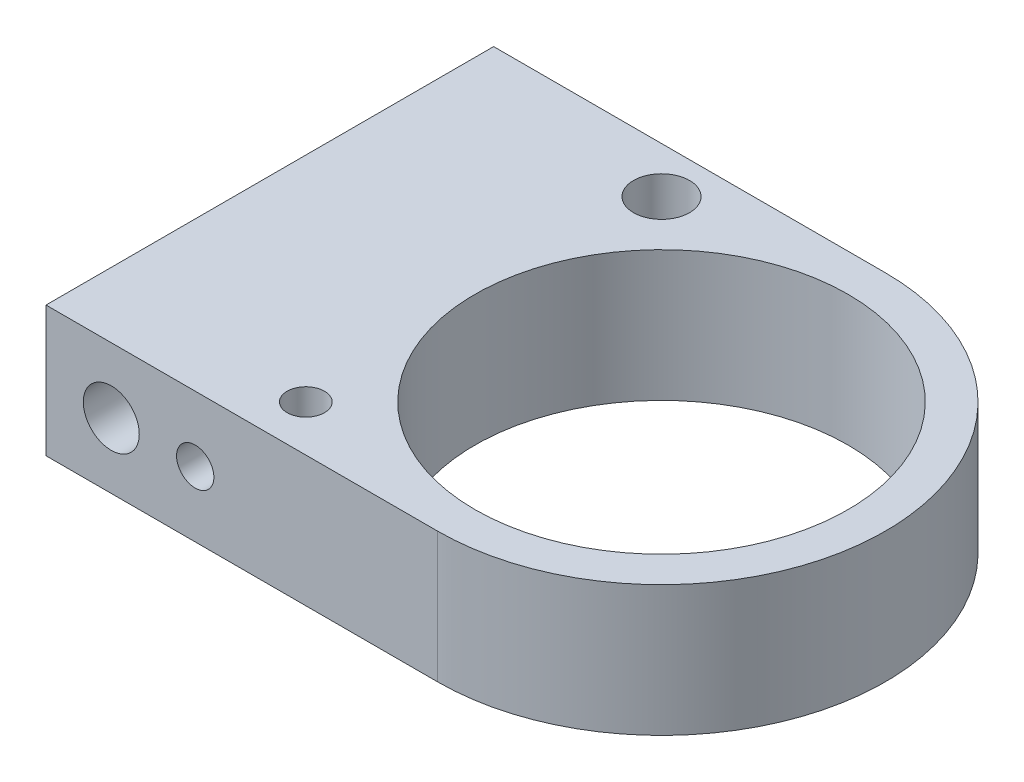
ISO-10303-21;
HEADER;
FILE_DESCRIPTION(('STEP AP214'),'2;1');
FILE_NAME('part.step','',(''),(''),'','','');
FILE_SCHEMA(('AUTOMOTIVE_DESIGN { 1 0 10303 214 1 1 1 1 }'));
ENDSEC;
DATA;
#1=APPLICATION_CONTEXT('core data for automotive mechanical design processes');
#2=APPLICATION_PROTOCOL_DEFINITION('international standard','automotive_design',2000,#1);
#3=PRODUCT_CONTEXT('',#1,'mechanical');
#4=PRODUCT('Part','Part','',(#3));
#5=PRODUCT_RELATED_PRODUCT_CATEGORY('part','',(#4));
#6=PRODUCT_DEFINITION_FORMATION('','',#4);
#7=PRODUCT_DEFINITION_CONTEXT('part definition',#1,'design');
#8=PRODUCT_DEFINITION('design','',#6,#7);
#9=PRODUCT_DEFINITION_SHAPE('','',#8);
#10=(LENGTH_UNIT() NAMED_UNIT(*) SI_UNIT(.MILLI.,.METRE.));
#11=(NAMED_UNIT(*) PLANE_ANGLE_UNIT() SI_UNIT($,.RADIAN.));
#12=(NAMED_UNIT(*) SI_UNIT($,.STERADIAN.) SOLID_ANGLE_UNIT());
#13=UNCERTAINTY_MEASURE_WITH_UNIT(LENGTH_MEASURE(1.E-05),#10,'distance_accuracy_value','');
#14=(GEOMETRIC_REPRESENTATION_CONTEXT(3) GLOBAL_UNCERTAINTY_ASSIGNED_CONTEXT((#13)) GLOBAL_UNIT_ASSIGNED_CONTEXT((#10,
#11,#12)) REPRESENTATION_CONTEXT('',''));
#15=CARTESIAN_POINT('',(0.,0.,0.));
#16=DIRECTION('',(0.,0.,1.));
#17=DIRECTION('',(1.,0.,0.));
#18=AXIS2_PLACEMENT_3D('',#15,#16,#17);
#19=CARTESIAN_POINT('',(0.,3.5,6.));
#20=DIRECTION('',(0.,0.,-1.));
#21=DIRECTION('',(-1.,0.,0.));
#22=AXIS2_PLACEMENT_3D('',#19,#20,#21);
#23=PLANE('',#22);
#24=CARTESIAN_POINT('',(-8.75,1.75,6.));
#25=DIRECTION('',(0.,0.,-1.));
#26=DIRECTION('',(-1.,0.,0.));
#27=AXIS2_PLACEMENT_3D('',#24,#25,#26);
#28=CIRCLE('',#27,0.75);
#29=CARTESIAN_POINT('',(-8.,1.75,6.));
#30=VERTEX_POINT('',#29);
#31=EDGE_CURVE('E118',#30,#30,#28,.T.);
#32=ORIENTED_EDGE('',*,*,#31,.T.);
#33=EDGE_LOOP('',(#32));
#34=FACE_BOUND('',#33,.T.);
#35=CARTESIAN_POINT('',(-6.5,1.75,6.));
#36=DIRECTION('',(0.,0.,-1.));
#37=DIRECTION('',(-1.,0.,0.));
#38=AXIS2_PLACEMENT_3D('',#35,#36,#37);
#39=CIRCLE('',#38,0.5);
#40=CARTESIAN_POINT('',(-7.,1.75,6.));
#41=VERTEX_POINT('',#40);
#42=EDGE_CURVE('E143',#41,#41,#39,.T.);
#43=ORIENTED_EDGE('',*,*,#42,.T.);
#44=EDGE_LOOP('',(#43));
#45=FACE_BOUND('',#44,.T.);
#46=DIRECTION('',(1.,0.,0.));
#47=VECTOR('',#46,1.);
#48=CARTESIAN_POINT('',(0.,0.,6.));
#49=LINE('',#48,#47);
#50=CARTESIAN_POINT('',(-10.5,0.,6.));
#51=VERTEX_POINT('',#50);
#52=CARTESIAN_POINT('',(0.,0.,6.));
#53=VERTEX_POINT('',#52);
#54=EDGE_CURVE('E114',#51,#53,#49,.T.);
#55=ORIENTED_EDGE('',*,*,#54,.T.);
#56=DIRECTION('',(0.,-1.,0.));
#57=VECTOR('',#56,1.);
#58=CARTESIAN_POINT('',(0.,3.5,6.));
#59=LINE('',#58,#57);
#60=CARTESIAN_POINT('',(0.,3.5,6.));
#61=VERTEX_POINT('',#60);
#62=EDGE_CURVE('E11',#61,#53,#59,.T.);
#63=ORIENTED_EDGE('',*,*,#62,.F.);
#64=DIRECTION('',(1.,0.,0.));
#65=VECTOR('',#64,1.);
#66=CARTESIAN_POINT('',(0.,3.5,6.));
#67=LINE('',#66,#65);
#68=CARTESIAN_POINT('',(-10.5,3.5,6.));
#69=VERTEX_POINT('',#68);
#70=EDGE_CURVE('E94',#69,#61,#67,.T.);
#71=ORIENTED_EDGE('',*,*,#70,.F.);
#72=DIRECTION('',(0.,-1.,0.));
#73=VECTOR('',#72,1.);
#74=CARTESIAN_POINT('',(-10.5,3.5,6.));
#75=LINE('',#74,#73);
#76=EDGE_CURVE('E113',#69,#51,#75,.T.);
#77=ORIENTED_EDGE('',*,*,#76,.T.);
#78=EDGE_LOOP('',(#55,#63,#71,#77));
#79=FACE_BOUND('',#78,.T.);
#80=ADVANCED_FACE('F41',(#34,#45,#79),#23,.F.);
#81=CARTESIAN_POINT('',(0.,3.5,0.));
#82=DIRECTION('',(0.,-1.,0.));
#83=DIRECTION('',(0.,0.,-1.));
#84=AXIS2_PLACEMENT_3D('',#81,#82,#83);
#85=CYLINDRICAL_SURFACE('',#84,6.);
#86=CARTESIAN_POINT('',(0.,0.,0.));
#87=DIRECTION('',(0.,1.,0.));
#88=DIRECTION('',(0.,0.,1.));
#89=AXIS2_PLACEMENT_3D('',#86,#87,#88);
#90=CIRCLE('',#89,6.);
#91=CARTESIAN_POINT('',(0.,0.,-6.));
#92=VERTEX_POINT('',#91);
#93=EDGE_CURVE('E99',#53,#92,#90,.T.);
#94=ORIENTED_EDGE('',*,*,#93,.T.);
#95=DIRECTION('',(0.,-1.,0.));
#96=VECTOR('',#95,1.);
#97=CARTESIAN_POINT('',(0.,3.5,-6.));
#98=LINE('',#97,#96);
#99=CARTESIAN_POINT('',(0.,3.5,-6.));
#100=VERTEX_POINT('',#99);
#101=EDGE_CURVE('E50',#100,#92,#98,.T.);
#102=ORIENTED_EDGE('',*,*,#101,.F.);
#103=CARTESIAN_POINT('',(0.,3.5,0.));
#104=DIRECTION('',(0.,1.,0.));
#105=DIRECTION('',(0.,0.,1.));
#106=AXIS2_PLACEMENT_3D('',#103,#104,#105);
#107=CIRCLE('',#106,6.);
#108=EDGE_CURVE('E88',#61,#100,#107,.T.);
#109=ORIENTED_EDGE('',*,*,#108,.F.);
#110=ORIENTED_EDGE('',*,*,#62,.T.);
#111=EDGE_LOOP('',(#94,#102,#109,#110));
#112=FACE_BOUND('',#111,.T.);
#113=ADVANCED_FACE('F98',(#112),#85,.T.);
#114=CARTESIAN_POINT('',(0.,3.5,-5.99999999999998));
#115=DIRECTION('',(0.,0.,1.));
#116=DIRECTION('',(1.,0.,0.));
#117=AXIS2_PLACEMENT_3D('',#114,#115,#116);
#118=PLANE('',#117);
#119=CARTESIAN_POINT('',(-8.75,1.75,-6.));
#120=DIRECTION('',(0.,0.,1.));
#121=DIRECTION('',(1.,0.,0.));
#122=AXIS2_PLACEMENT_3D('',#119,#120,#121);
#123=CIRCLE('',#122,0.75);
#124=CARTESIAN_POINT('',(-8.,1.75,-6.));
#125=VERTEX_POINT('',#124);
#126=EDGE_CURVE('E147',#125,#125,#123,.T.);
#127=ORIENTED_EDGE('',*,*,#126,.T.);
#128=EDGE_LOOP('',(#127));
#129=FACE_BOUND('',#128,.T.);
#130=CARTESIAN_POINT('',(-6.5,1.75,-6.));
#131=DIRECTION('',(0.,0.,1.));
#132=DIRECTION('',(1.,0.,0.));
#133=AXIS2_PLACEMENT_3D('',#130,#131,#132);
#134=CIRCLE('',#133,0.5);
#135=CARTESIAN_POINT('',(-6.,1.75,-6.));
#136=VERTEX_POINT('',#135);
#137=EDGE_CURVE('E148',#136,#136,#134,.T.);
#138=ORIENTED_EDGE('',*,*,#137,.T.);
#139=EDGE_LOOP('',(#138));
#140=FACE_BOUND('',#139,.T.);
#141=DIRECTION('',(-1.,0.,0.));
#142=VECTOR('',#141,1.);
#143=CARTESIAN_POINT('',(0.,0.,-5.99999999999998));
#144=LINE('',#143,#142);
#145=CARTESIAN_POINT('',(-10.5,0.,-6.));
#146=VERTEX_POINT('',#145);
#147=EDGE_CURVE('E75',#92,#146,#144,.T.);
#148=ORIENTED_EDGE('',*,*,#147,.T.);
#149=DIRECTION('',(0.,-1.,0.));
#150=VECTOR('',#149,1.);
#151=CARTESIAN_POINT('',(-10.5,3.5,-6.));
#152=LINE('',#151,#150);
#153=CARTESIAN_POINT('',(-10.5,3.5,-6.));
#154=VERTEX_POINT('',#153);
#155=EDGE_CURVE('E101',#154,#146,#152,.T.);
#156=ORIENTED_EDGE('',*,*,#155,.F.);
#157=DIRECTION('',(-1.,0.,0.));
#158=VECTOR('',#157,1.);
#159=CARTESIAN_POINT('',(0.,3.5,-5.99999999999998));
#160=LINE('',#159,#158);
#161=EDGE_CURVE('E92',#100,#154,#160,.T.);
#162=ORIENTED_EDGE('',*,*,#161,.F.);
#163=ORIENTED_EDGE('',*,*,#101,.T.);
#164=EDGE_LOOP('',(#148,#156,#162,#163));
#165=FACE_BOUND('',#164,.T.);
#166=ADVANCED_FACE('F102',(#129,#140,#165),#118,.F.);
#167=CARTESIAN_POINT('',(-10.5,3.5,0.));
#168=DIRECTION('',(1.,0.,0.));
#169=DIRECTION('',(0.,0.,-1.));
#170=AXIS2_PLACEMENT_3D('',#167,#168,#169);
#171=PLANE('',#170);
#172=DIRECTION('',(0.,0.,1.));
#173=VECTOR('',#172,1.);
#174=CARTESIAN_POINT('',(-10.5,0.,0.));
#175=LINE('',#174,#173);
#176=EDGE_CURVE('E81',#146,#51,#175,.T.);
#177=ORIENTED_EDGE('',*,*,#176,.T.);
#178=ORIENTED_EDGE('',*,*,#76,.F.);
#179=DIRECTION('',(0.,0.,1.));
#180=VECTOR('',#179,1.);
#181=CARTESIAN_POINT('',(-10.5,3.5,0.));
#182=LINE('',#181,#180);
#183=EDGE_CURVE('E58',#154,#69,#182,.T.);
#184=ORIENTED_EDGE('',*,*,#183,.F.);
#185=ORIENTED_EDGE('',*,*,#155,.T.);
#186=EDGE_LOOP('',(#177,#178,#184,#185));
#187=FACE_BOUND('',#186,.T.);
#188=ADVANCED_FACE('F132',(#187),#171,.F.);
#189=CARTESIAN_POINT('',(0.,3.5,0.));
#190=DIRECTION('',(0.,-1.,0.));
#191=DIRECTION('',(0.,0.,-1.));
#192=AXIS2_PLACEMENT_3D('',#189,#190,#191);
#193=CYLINDRICAL_SURFACE('',#192,5.);
#194=CARTESIAN_POINT('',(0.,3.5,0.));
#195=DIRECTION('',(0.,1.,0.));
#196=DIRECTION('',(0.,0.,1.));
#197=AXIS2_PLACEMENT_3D('',#194,#195,#196);
#198=CIRCLE('',#197,5.);
#199=CARTESIAN_POINT('',(0.,3.5,5.));
#200=VERTEX_POINT('',#199);
#201=EDGE_CURVE('E106',#200,#200,#198,.T.);
#202=ORIENTED_EDGE('',*,*,#201,.T.);
#203=EDGE_LOOP('',(#202));
#204=FACE_BOUND('',#203,.T.);
#205=CARTESIAN_POINT('',(0.,0.,0.));
#206=DIRECTION('',(0.,1.,0.));
#207=DIRECTION('',(0.,0.,1.));
#208=AXIS2_PLACEMENT_3D('',#205,#206,#207);
#209=CIRCLE('',#208,5.);
#210=CARTESIAN_POINT('',(0.,0.,5.));
#211=VERTEX_POINT('',#210);
#212=EDGE_CURVE('E125',#211,#211,#209,.T.);
#213=ORIENTED_EDGE('',*,*,#212,.F.);
#214=EDGE_LOOP('',(#213));
#215=FACE_BOUND('',#214,.T.);
#216=ADVANCED_FACE('F183',(#204,#215),#193,.F.);
#217=CARTESIAN_POINT('',(0.,3.5,0.));
#218=DIRECTION('',(0.,1.,0.));
#219=DIRECTION('',(0.,0.,1.));
#220=AXIS2_PLACEMENT_3D('',#217,#218,#219);
#221=PLANE('',#220);
#222=CARTESIAN_POINT('',(-4.76776695296637,3.5,-4.76776695296637));
#223=DIRECTION('',(0.,1.,0.));
#224=DIRECTION('',(0.,0.,1.));
#225=AXIS2_PLACEMENT_3D('',#222,#223,#224);
#226=CIRCLE('',#225,0.75);
#227=CARTESIAN_POINT('',(-4.76776695296637,3.5,-4.01776695296637));
#228=VERTEX_POINT('',#227);
#229=EDGE_CURVE('E164',#228,#228,#226,.T.);
#230=ORIENTED_EDGE('',*,*,#229,.F.);
#231=EDGE_LOOP('',(#230));
#232=FACE_BOUND('',#231,.T.);
#233=CARTESIAN_POINT('',(-4.76776695296637,3.5,4.76776695296637));
#234=DIRECTION('',(0.,1.,0.));
#235=DIRECTION('',(0.,0.,-1.));
#236=AXIS2_PLACEMENT_3D('',#233,#234,#235);
#237=CIRCLE('',#236,0.500000000000001);
#238=CARTESIAN_POINT('',(-4.76776695296637,3.5,4.26776695296637));
#239=VERTEX_POINT('',#238);
#240=EDGE_CURVE('E156',#239,#239,#237,.T.);
#241=ORIENTED_EDGE('',*,*,#240,.F.);
#242=EDGE_LOOP('',(#241));
#243=FACE_BOUND('',#242,.T.);
#244=ORIENTED_EDGE('',*,*,#70,.T.);
#245=ORIENTED_EDGE('',*,*,#108,.T.);
#246=ORIENTED_EDGE('',*,*,#161,.T.);
#247=ORIENTED_EDGE('',*,*,#183,.T.);
#248=EDGE_LOOP('',(#244,#245,#246,#247));
#249=FACE_BOUND('',#248,.T.);
#250=ORIENTED_EDGE('',*,*,#201,.F.);
#251=EDGE_LOOP('',(#250));
#252=FACE_BOUND('',#251,.T.);
#253=ADVANCED_FACE('F89',(#232,#243,#249,#252),#221,.T.);
#254=CARTESIAN_POINT('',(0.,0.,0.));
#255=DIRECTION('',(0.,1.,0.));
#256=DIRECTION('',(0.,0.,1.));
#257=AXIS2_PLACEMENT_3D('',#254,#255,#256);
#258=PLANE('',#257);
#259=CARTESIAN_POINT('',(-4.76776695296637,0.,-4.76776695296637));
#260=DIRECTION('',(0.,1.,0.));
#261=DIRECTION('',(0.,0.,1.));
#262=AXIS2_PLACEMENT_3D('',#259,#260,#261);
#263=CIRCLE('',#262,0.75);
#264=CARTESIAN_POINT('',(-4.76776695296637,0.,-4.01776695296637));
#265=VERTEX_POINT('',#264);
#266=EDGE_CURVE('E152',#265,#265,#263,.T.);
#267=ORIENTED_EDGE('',*,*,#266,.T.);
#268=EDGE_LOOP('',(#267));
#269=FACE_BOUND('',#268,.T.);
#270=CARTESIAN_POINT('',(-4.76776695296637,0.,4.76776695296637));
#271=DIRECTION('',(0.,1.,0.));
#272=DIRECTION('',(0.,0.,-1.));
#273=AXIS2_PLACEMENT_3D('',#270,#271,#272);
#274=CIRCLE('',#273,0.500000000000001);
#275=CARTESIAN_POINT('',(-4.76776695296637,0.,4.26776695296637));
#276=VERTEX_POINT('',#275);
#277=EDGE_CURVE('E160',#276,#276,#274,.T.);
#278=ORIENTED_EDGE('',*,*,#277,.T.);
#279=EDGE_LOOP('',(#278));
#280=FACE_BOUND('',#279,.T.);
#281=ORIENTED_EDGE('',*,*,#54,.F.);
#282=ORIENTED_EDGE('',*,*,#176,.F.);
#283=ORIENTED_EDGE('',*,*,#147,.F.);
#284=ORIENTED_EDGE('',*,*,#93,.F.);
#285=EDGE_LOOP('',(#281,#282,#283,#284));
#286=FACE_BOUND('',#285,.T.);
#287=ORIENTED_EDGE('',*,*,#212,.T.);
#288=EDGE_LOOP('',(#287));
#289=FACE_BOUND('',#288,.T.);
#290=ADVANCED_FACE('F135',(#269,#280,#286,#289),#258,.F.);
#291=CARTESIAN_POINT('',(-6.5,1.75,-6.));
#292=DIRECTION('',(0.,0.,1.));
#293=DIRECTION('',(1.,0.,0.));
#294=AXIS2_PLACEMENT_3D('',#291,#292,#293);
#295=CYLINDRICAL_SURFACE('',#294,0.5);
#296=ORIENTED_EDGE('',*,*,#137,.F.);
#297=EDGE_LOOP('',(#296));
#298=FACE_BOUND('',#297,.T.);
#299=ORIENTED_EDGE('',*,*,#42,.F.);
#300=EDGE_LOOP('',(#299));
#301=FACE_BOUND('',#300,.T.);
#302=ADVANCED_FACE('F194',(#298,#301),#295,.F.);
#303=CARTESIAN_POINT('',(-8.75,1.75,-6.));
#304=DIRECTION('',(0.,0.,1.));
#305=DIRECTION('',(1.,0.,0.));
#306=AXIS2_PLACEMENT_3D('',#303,#304,#305);
#307=CYLINDRICAL_SURFACE('',#306,0.75);
#308=CARTESIAN_POINT('',(-8.,1.75,-6.));
#309=CARTESIAN_POINT('',(-8.,1.75,-5.875));
#310=CARTESIAN_POINT('',(-8.,1.75,-5.75));
#311=CARTESIAN_POINT('',(-8.,1.75,-5.5));
#312=CARTESIAN_POINT('',(-8.,1.75,-5.375));
#313=CARTESIAN_POINT('',(-8.,1.75,-5.125));
#314=CARTESIAN_POINT('',(-8.,1.75,-5.));
#315=CARTESIAN_POINT('',(-8.,1.75,-4.75));
#316=CARTESIAN_POINT('',(-8.,1.75,-4.625));
#317=CARTESIAN_POINT('',(-8.,1.75,-4.375));
#318=CARTESIAN_POINT('',(-8.,1.75,-4.25));
#319=CARTESIAN_POINT('',(-8.,1.75,-4.));
#320=CARTESIAN_POINT('',(-8.,1.75,-3.875));
#321=CARTESIAN_POINT('',(-8.,1.75,-3.625));
#322=CARTESIAN_POINT('',(-8.,1.75,-3.5));
#323=CARTESIAN_POINT('',(-8.,1.75,-3.25));
#324=CARTESIAN_POINT('',(-8.,1.75,-3.125));
#325=CARTESIAN_POINT('',(-8.,1.75,-2.875));
#326=CARTESIAN_POINT('',(-8.,1.75,-2.75));
#327=CARTESIAN_POINT('',(-8.,1.75,-2.5));
#328=CARTESIAN_POINT('',(-8.,1.75,-2.375));
#329=CARTESIAN_POINT('',(-8.,1.75,-2.125));
#330=CARTESIAN_POINT('',(-8.,1.75,-2.));
#331=CARTESIAN_POINT('',(-8.,1.75,-1.75));
#332=CARTESIAN_POINT('',(-8.,1.75,-1.625));
#333=CARTESIAN_POINT('',(-8.,1.75,-1.375));
#334=CARTESIAN_POINT('',(-8.,1.75,-1.25));
#335=CARTESIAN_POINT('',(-8.,1.75,-1.));
#336=CARTESIAN_POINT('',(-8.,1.75,-0.875000000000001));
#337=CARTESIAN_POINT('',(-8.,1.75,-0.625000000000001));
#338=CARTESIAN_POINT('',(-8.,1.75,-0.500000000000001));
#339=CARTESIAN_POINT('',(-8.,1.75,-0.250000000000001));
#340=CARTESIAN_POINT('',(-8.,1.75,-0.125000000000001));
#341=CARTESIAN_POINT('',(-8.,1.75,0.124999999999999));
#342=CARTESIAN_POINT('',(-8.,1.75,0.249999999999999));
#343=CARTESIAN_POINT('',(-8.,1.75,0.5));
#344=CARTESIAN_POINT('',(-8.,1.75,0.625));
#345=CARTESIAN_POINT('',(-8.,1.75,0.875));
#346=CARTESIAN_POINT('',(-8.,1.75,0.999999999999999));
#347=CARTESIAN_POINT('',(-8.,1.75,1.25));
#348=CARTESIAN_POINT('',(-8.,1.75,1.375));
#349=CARTESIAN_POINT('',(-8.,1.75,1.625));
#350=CARTESIAN_POINT('',(-8.,1.75,1.75));
#351=CARTESIAN_POINT('',(-8.,1.75,2.));
#352=CARTESIAN_POINT('',(-8.,1.75,2.125));
#353=CARTESIAN_POINT('',(-8.,1.75,2.375));
#354=CARTESIAN_POINT('',(-8.,1.75,2.5));
#355=CARTESIAN_POINT('',(-8.,1.75,2.75));
#356=CARTESIAN_POINT('',(-8.,1.75,2.875));
#357=CARTESIAN_POINT('',(-8.,1.75,3.125));
#358=CARTESIAN_POINT('',(-8.,1.75,3.25));
#359=CARTESIAN_POINT('',(-8.,1.75,3.5));
#360=CARTESIAN_POINT('',(-8.,1.75,3.625));
#361=CARTESIAN_POINT('',(-8.,1.75,3.875));
#362=CARTESIAN_POINT('',(-8.,1.75,4.));
#363=CARTESIAN_POINT('',(-8.,1.75,4.25));
#364=CARTESIAN_POINT('',(-8.,1.75,4.375));
#365=CARTESIAN_POINT('',(-8.,1.75,4.625));
#366=CARTESIAN_POINT('',(-8.,1.75,4.75));
#367=CARTESIAN_POINT('',(-8.,1.75,5.));
#368=CARTESIAN_POINT('',(-8.,1.75,5.125));
#369=CARTESIAN_POINT('',(-8.,1.75,5.375));
#370=CARTESIAN_POINT('',(-8.,1.75,5.5));
#371=CARTESIAN_POINT('',(-8.,1.75,5.75));
#372=CARTESIAN_POINT('',(-8.,1.75,5.875));
#373=CARTESIAN_POINT('',(-8.,1.75,6.));
#374=B_SPLINE_CURVE_WITH_KNOTS('',3,(#308,#309,#310,#311,#312,#313,#314,#315,#316,#317,#318,
#319,#320,#321,#322,#323,#324,#325,#326,#327,#328,#329,#330,#331,#332,#333,#334,#335,#336,#337,
#338,#339,#340,#341,#342,#343,#344,#345,#346,#347,#348,#349,#350,#351,#352,#353,#354,#355,#356,
#357,#358,#359,#360,#361,#362,#363,#364,#365,#366,#367,#368,#369,#370,#371,#372,#373),
.UNSPECIFIED.,.F.,.F.,(4,2,2,2,2,2,2,2,2,2,2,2,2,2,2,2,2,2,2,2,2,2,2,2,2,2,2,2,2,2,2,2,4),(0.,
0.375,0.750000000000001,1.125,1.5,1.875,2.25,2.625,3.,3.375,3.75,4.125,4.5,4.875,5.25,5.625,6.,
6.375,6.75,7.125,7.5,7.875,8.25,8.625,9.,9.375,9.75,10.125,10.5,10.875,11.25,11.625,12.),.UNSPECIFIED.);
#375=EDGE_CURVE('BSEAM188',#125,#30,#374,.T.);
#376=ORIENTED_EDGE('',*,*,#126,.F.);
#377=ORIENTED_EDGE('',*,*,#31,.F.);
#378=ORIENTED_EDGE('',*,*,#375,.T.);
#379=ORIENTED_EDGE('',*,*,#375,.F.);
#380=EDGE_LOOP('',(#376,#378,#377,#379));
#381=FACE_BOUND('',#380,.T.);
#382=ADVANCED_FACE('F188',(#381),#307,.F.);
#383=CARTESIAN_POINT('',(-4.76776695296637,0.,4.76776695296637));
#384=DIRECTION('',(0.,1.,0.));
#385=DIRECTION('',(0.,0.,1.));
#386=AXIS2_PLACEMENT_3D('',#383,#384,#385);
#387=CYLINDRICAL_SURFACE('',#386,0.500000000000001);
#388=ORIENTED_EDGE('',*,*,#277,.F.);
#389=EDGE_LOOP('',(#388));
#390=FACE_BOUND('',#389,.T.);
#391=ORIENTED_EDGE('',*,*,#240,.T.);
#392=EDGE_LOOP('',(#391));
#393=FACE_BOUND('',#392,.T.);
#394=ADVANCED_FACE('F177',(#390,#393),#387,.F.);
#395=CARTESIAN_POINT('',(-4.76776695296637,0.,-4.76776695296637));
#396=DIRECTION('',(0.,1.,0.));
#397=DIRECTION('',(0.,0.,1.));
#398=AXIS2_PLACEMENT_3D('',#395,#396,#397);
#399=CYLINDRICAL_SURFACE('',#398,0.75);
#400=ORIENTED_EDGE('',*,*,#266,.F.);
#401=EDGE_LOOP('',(#400));
#402=FACE_BOUND('',#401,.T.);
#403=ORIENTED_EDGE('',*,*,#229,.T.);
#404=EDGE_LOOP('',(#403));
#405=FACE_BOUND('',#404,.T.);
#406=ADVANCED_FACE('F174',(#402,#405),#399,.F.);
#407=CLOSED_SHELL('',(#80,#113,#166,#188,#216,#253,#290,#302,#382,#394,#406));
#408=MANIFOLD_SOLID_BREP('B2',#407);
#409=ADVANCED_BREP_SHAPE_REPRESENTATION('',(#18,#408),#14);
#410=SHAPE_DEFINITION_REPRESENTATION(#9,#409);
ENDSEC;
END-ISO-10303-21;
